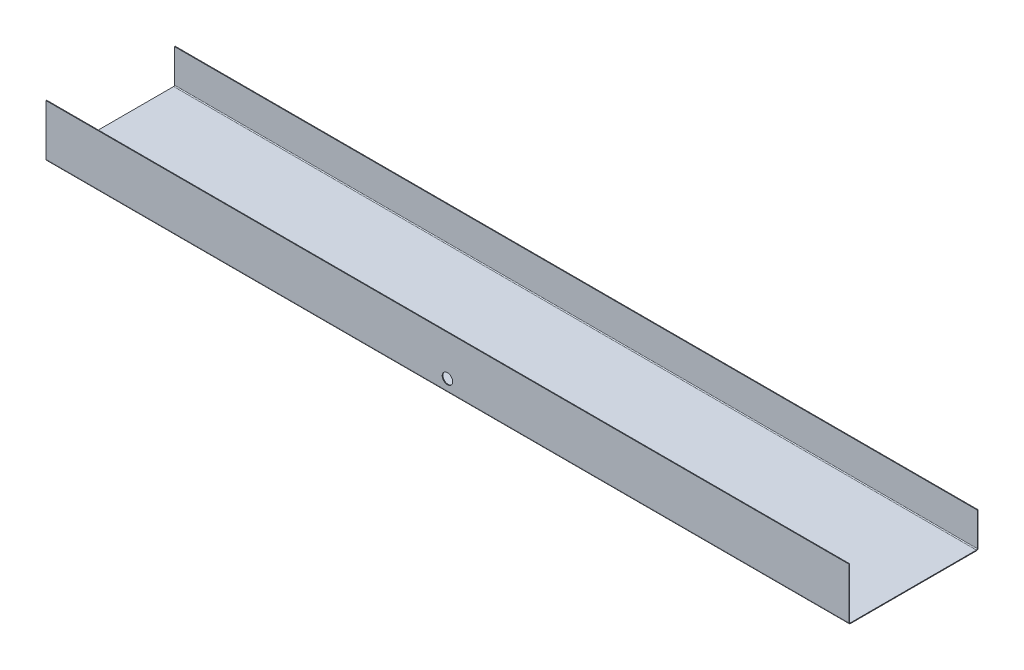
ISO-10303-21;
HEADER;
FILE_DESCRIPTION(('STEP AP214'),'2;1');
FILE_NAME('part.step','',(''),(''),'','','');
FILE_SCHEMA(('AUTOMOTIVE_DESIGN { 1 0 10303 214 1 1 1 1 }'));
ENDSEC;
DATA;
#1=APPLICATION_CONTEXT('core data for automotive mechanical design processes');
#2=APPLICATION_PROTOCOL_DEFINITION('international standard','automotive_design',2000,#1);
#3=PRODUCT_CONTEXT('',#1,'mechanical');
#4=PRODUCT('Part','Part','',(#3));
#5=PRODUCT_RELATED_PRODUCT_CATEGORY('part','',(#4));
#6=PRODUCT_DEFINITION_FORMATION('','',#4);
#7=PRODUCT_DEFINITION_CONTEXT('part definition',#1,'design');
#8=PRODUCT_DEFINITION('design','',#6,#7);
#9=PRODUCT_DEFINITION_SHAPE('','',#8);
#10=(LENGTH_UNIT() NAMED_UNIT(*) SI_UNIT(.MILLI.,.METRE.));
#11=(NAMED_UNIT(*) PLANE_ANGLE_UNIT() SI_UNIT($,.RADIAN.));
#12=(NAMED_UNIT(*) SI_UNIT($,.STERADIAN.) SOLID_ANGLE_UNIT());
#13=UNCERTAINTY_MEASURE_WITH_UNIT(LENGTH_MEASURE(1.E-05),#10,'distance_accuracy_value','');
#14=(GEOMETRIC_REPRESENTATION_CONTEXT(3) GLOBAL_UNCERTAINTY_ASSIGNED_CONTEXT((#13)) GLOBAL_UNIT_ASSIGNED_CONTEXT((#10,
#11,#12)) REPRESENTATION_CONTEXT('',''));
#15=CARTESIAN_POINT('',(0.,0.,0.));
#16=DIRECTION('',(0.,0.,1.));
#17=DIRECTION('',(1.,0.,0.));
#18=AXIS2_PLACEMENT_3D('',#15,#16,#17);
#19=CARTESIAN_POINT('',(1150.,-145.5,0.));
#20=DIRECTION('',(1.,0.,0.));
#21=DIRECTION('',(0.,0.,-1.));
#22=AXIS2_PLACEMENT_3D('',#19,#20,#21);
#23=PLANE('',#22);
#24=DIRECTION('',(0.,0.,-1.));
#25=VECTOR('',#24,1.);
#26=CARTESIAN_POINT('',(1150.,-145.5,0.));
#27=LINE('',#26,#25);
#28=CARTESIAN_POINT('',(1150.,-145.5,0.));
#29=VERTEX_POINT('',#28);
#30=CARTESIAN_POINT('',(1150.,-145.5,-2.00000000000002));
#31=VERTEX_POINT('',#30);
#32=EDGE_CURVE('E11',#29,#31,#27,.T.);
#33=ORIENTED_EDGE('',*,*,#32,.F.);
#34=CARTESIAN_POINT('',(1150.,-145.5,-4.50000000000002));
#35=DIRECTION('',(-1.,0.,0.));
#36=DIRECTION('',(0.,0.,1.));
#37=AXIS2_PLACEMENT_3D('',#34,#35,#36);
#38=CIRCLE('',#37,4.5);
#39=CARTESIAN_POINT('',(1150.,-150.,-4.50000000000002));
#40=VERTEX_POINT('',#39);
#41=EDGE_CURVE('E150',#29,#40,#38,.F.);
#42=ORIENTED_EDGE('',*,*,#41,.T.);
#43=DIRECTION('',(0.,-1.,0.));
#44=VECTOR('',#43,1.);
#45=CARTESIAN_POINT('',(1150.,-148.,-4.50000000000002));
#46=LINE('',#45,#44);
#47=CARTESIAN_POINT('',(1150.,-148.,-4.50000000000002));
#48=VERTEX_POINT('',#47);
#49=EDGE_CURVE('E48',#48,#40,#46,.T.);
#50=ORIENTED_EDGE('',*,*,#49,.F.);
#51=CARTESIAN_POINT('',(1150.,-145.5,-4.50000000000002));
#52=DIRECTION('',(1.,0.,0.));
#53=DIRECTION('',(0.,0.,-1.));
#54=AXIS2_PLACEMENT_3D('',#51,#52,#53);
#55=CIRCLE('',#54,2.5);
#56=EDGE_CURVE('E245',#31,#48,#55,.T.);
#57=ORIENTED_EDGE('',*,*,#56,.F.);
#58=EDGE_LOOP('',(#33,#42,#50,#57));
#59=FACE_BOUND('',#58,.T.);
#60=ADVANCED_FACE('F40',(#59),#23,.T.);
#61=CARTESIAN_POINT('',(1150.,-148.,-4.50000000000002));
#62=DIRECTION('',(1.,0.,0.));
#63=DIRECTION('',(0.,0.,-1.));
#64=AXIS2_PLACEMENT_3D('',#61,#62,#63);
#65=PLANE('',#64);
#66=DIRECTION('',(0.,-1.,0.));
#67=VECTOR('',#66,1.);
#68=CARTESIAN_POINT('',(1150.,0.,0.));
#69=LINE('',#68,#67);
#70=CARTESIAN_POINT('',(1150.,0.,0.));
#71=VERTEX_POINT('',#70);
#72=EDGE_CURVE('E155',#71,#29,#69,.T.);
#73=ORIENTED_EDGE('',*,*,#72,.T.);
#74=ORIENTED_EDGE('',*,*,#32,.T.);
#75=DIRECTION('',(0.,-1.,0.));
#76=VECTOR('',#75,1.);
#77=CARTESIAN_POINT('',(1150.,0.,-2.));
#78=LINE('',#77,#76);
#79=CARTESIAN_POINT('',(1150.,0.,-2.));
#80=VERTEX_POINT('',#79);
#81=EDGE_CURVE('E258',#80,#31,#78,.T.);
#82=ORIENTED_EDGE('',*,*,#81,.F.);
#83=DIRECTION('',(0.,0.,-1.));
#84=VECTOR('',#83,1.);
#85=CARTESIAN_POINT('',(1150.,0.,0.));
#86=LINE('',#85,#84);
#87=EDGE_CURVE('E260',#71,#80,#86,.T.);
#88=ORIENTED_EDGE('',*,*,#87,.F.);
#89=EDGE_LOOP('',(#73,#74,#82,#88));
#90=FACE_BOUND('',#89,.T.);
#91=ADVANCED_FACE('F271',(#90),#65,.T.);
#92=CARTESIAN_POINT('',(-1150.,-150.,-4.50000000000002));
#93=DIRECTION('',(-1.,0.,0.));
#94=DIRECTION('',(0.,0.,1.));
#95=AXIS2_PLACEMENT_3D('',#92,#93,#94);
#96=PLANE('',#95);
#97=DIRECTION('',(0.,1.,0.));
#98=VECTOR('',#97,1.);
#99=CARTESIAN_POINT('',(-1150.,-150.,-4.50000000000002));
#100=LINE('',#99,#98);
#101=CARTESIAN_POINT('',(-1150.,-150.,-4.50000000000002));
#102=VERTEX_POINT('',#101);
#103=CARTESIAN_POINT('',(-1150.,-148.,-4.50000000000002));
#104=VERTEX_POINT('',#103);
#105=EDGE_CURVE('E148',#102,#104,#100,.T.);
#106=ORIENTED_EDGE('',*,*,#105,.F.);
#107=CARTESIAN_POINT('',(-1150.,-145.5,-4.50000000000002));
#108=DIRECTION('',(-1.,0.,0.));
#109=DIRECTION('',(0.,0.,1.));
#110=AXIS2_PLACEMENT_3D('',#107,#108,#109);
#111=CIRCLE('',#110,4.5);
#112=CARTESIAN_POINT('',(-1150.,-145.5,0.));
#113=VERTEX_POINT('',#112);
#114=EDGE_CURVE('E162',#113,#102,#111,.F.);
#115=ORIENTED_EDGE('',*,*,#114,.F.);
#116=DIRECTION('',(0.,0.,1.));
#117=VECTOR('',#116,1.);
#118=CARTESIAN_POINT('',(-1150.,-145.5,-2.00000000000002));
#119=LINE('',#118,#117);
#120=CARTESIAN_POINT('',(-1150.,-145.5,-2.00000000000002));
#121=VERTEX_POINT('',#120);
#122=EDGE_CURVE('E236',#121,#113,#119,.T.);
#123=ORIENTED_EDGE('',*,*,#122,.F.);
#124=CARTESIAN_POINT('',(-1150.,-145.5,-4.50000000000002));
#125=DIRECTION('',(1.,0.,0.));
#126=DIRECTION('',(0.,0.,-1.));
#127=AXIS2_PLACEMENT_3D('',#124,#125,#126);
#128=CIRCLE('',#127,2.5);
#129=EDGE_CURVE('E190',#121,#104,#128,.T.);
#130=ORIENTED_EDGE('',*,*,#129,.T.);
#131=EDGE_LOOP('',(#106,#115,#123,#130));
#132=FACE_BOUND('',#131,.T.);
#133=ADVANCED_FACE('F250',(#132),#96,.T.);
#134=CARTESIAN_POINT('',(-1150.,-145.5,-2.00000000000002));
#135=DIRECTION('',(-1.,0.,0.));
#136=DIRECTION('',(0.,0.,1.));
#137=AXIS2_PLACEMENT_3D('',#134,#135,#136);
#138=PLANE('',#137);
#139=DIRECTION('',(0.,0.,-1.));
#140=VECTOR('',#139,1.);
#141=CARTESIAN_POINT('',(-1150.,-150.,0.));
#142=LINE('',#141,#140);
#143=CARTESIAN_POINT('',(-1150.,-150.,-365.5));
#144=VERTEX_POINT('',#143);
#145=EDGE_CURVE('E203',#102,#144,#142,.T.);
#146=ORIENTED_EDGE('',*,*,#145,.F.);
#147=ORIENTED_EDGE('',*,*,#105,.T.);
#148=DIRECTION('',(0.,0.,-1.));
#149=VECTOR('',#148,1.);
#150=CARTESIAN_POINT('',(-1150.,-148.,0.));
#151=LINE('',#150,#149);
#152=CARTESIAN_POINT('',(-1150.,-148.,-365.5));
#153=VERTEX_POINT('',#152);
#154=EDGE_CURVE('E188',#104,#153,#151,.T.);
#155=ORIENTED_EDGE('',*,*,#154,.T.);
#156=DIRECTION('',(0.,-1.,0.));
#157=VECTOR('',#156,1.);
#158=CARTESIAN_POINT('',(-1150.,-148.,-365.5));
#159=LINE('',#158,#157);
#160=EDGE_CURVE('E97',#153,#144,#159,.T.);
#161=ORIENTED_EDGE('',*,*,#160,.T.);
#162=EDGE_LOOP('',(#146,#147,#155,#161));
#163=FACE_BOUND('',#162,.T.);
#164=ADVANCED_FACE('F238',(#163),#138,.T.);
#165=CARTESIAN_POINT('',(1150.,-150.,-365.5));
#166=DIRECTION('',(1.,0.,0.));
#167=DIRECTION('',(0.,0.,-1.));
#168=AXIS2_PLACEMENT_3D('',#165,#166,#167);
#169=PLANE('',#168);
#170=DIRECTION('',(0.,1.,0.));
#171=VECTOR('',#170,1.);
#172=CARTESIAN_POINT('',(1150.,-150.,-365.5));
#173=LINE('',#172,#171);
#174=CARTESIAN_POINT('',(1150.,-150.,-365.5));
#175=VERTEX_POINT('',#174);
#176=CARTESIAN_POINT('',(1150.,-148.,-365.5));
#177=VERTEX_POINT('',#176);
#178=EDGE_CURVE('E234',#175,#177,#173,.T.);
#179=ORIENTED_EDGE('',*,*,#178,.F.);
#180=CARTESIAN_POINT('',(1150.,-145.5,-365.5));
#181=DIRECTION('',(-1.,0.,0.));
#182=DIRECTION('',(0.,0.,1.));
#183=AXIS2_PLACEMENT_3D('',#180,#181,#182);
#184=CIRCLE('',#183,4.5);
#185=CARTESIAN_POINT('',(1150.,-145.5,-370.));
#186=VERTEX_POINT('',#185);
#187=EDGE_CURVE('E170',#175,#186,#184,.F.);
#188=ORIENTED_EDGE('',*,*,#187,.T.);
#189=DIRECTION('',(0.,0.,-1.));
#190=VECTOR('',#189,1.);
#191=CARTESIAN_POINT('',(1150.,-145.5,-368.));
#192=LINE('',#191,#190);
#193=CARTESIAN_POINT('',(1150.,-145.5,-368.));
#194=VERTEX_POINT('',#193);
#195=EDGE_CURVE('E56',#194,#186,#192,.T.);
#196=ORIENTED_EDGE('',*,*,#195,.F.);
#197=CARTESIAN_POINT('',(1150.,-145.5,-365.5));
#198=DIRECTION('',(1.,0.,0.));
#199=DIRECTION('',(0.,0.,-1.));
#200=AXIS2_PLACEMENT_3D('',#197,#198,#199);
#201=CIRCLE('',#200,2.5);
#202=EDGE_CURVE('E262',#177,#194,#201,.T.);
#203=ORIENTED_EDGE('',*,*,#202,.F.);
#204=EDGE_LOOP('',(#179,#188,#196,#203));
#205=FACE_BOUND('',#204,.T.);
#206=ADVANCED_FACE('F299',(#205),#169,.T.);
#207=CARTESIAN_POINT('',(1150.,-145.5,-368.));
#208=DIRECTION('',(1.,0.,0.));
#209=DIRECTION('',(0.,0.,-1.));
#210=AXIS2_PLACEMENT_3D('',#207,#208,#209);
#211=PLANE('',#210);
#212=DIRECTION('',(0.,0.,-1.));
#213=VECTOR('',#212,1.);
#214=CARTESIAN_POINT('',(1150.,-150.,0.));
#215=LINE('',#214,#213);
#216=EDGE_CURVE('E140',#40,#175,#215,.T.);
#217=ORIENTED_EDGE('',*,*,#216,.T.);
#218=ORIENTED_EDGE('',*,*,#178,.T.);
#219=DIRECTION('',(0.,0.,-1.));
#220=VECTOR('',#219,1.);
#221=CARTESIAN_POINT('',(1150.,-148.,0.));
#222=LINE('',#221,#220);
#223=EDGE_CURVE('E143',#48,#177,#222,.T.);
#224=ORIENTED_EDGE('',*,*,#223,.F.);
#225=ORIENTED_EDGE('',*,*,#49,.T.);
#226=EDGE_LOOP('',(#217,#218,#224,#225));
#227=FACE_BOUND('',#226,.T.);
#228=ADVANCED_FACE('F138',(#227),#211,.T.);
#229=CARTESIAN_POINT('',(-1150.,-145.5,-370.));
#230=DIRECTION('',(-1.,0.,0.));
#231=DIRECTION('',(0.,0.,1.));
#232=AXIS2_PLACEMENT_3D('',#229,#230,#231);
#233=PLANE('',#232);
#234=DIRECTION('',(0.,0.,1.));
#235=VECTOR('',#234,1.);
#236=CARTESIAN_POINT('',(-1150.,-145.5,-370.));
#237=LINE('',#236,#235);
#238=CARTESIAN_POINT('',(-1150.,-145.5,-370.));
#239=VERTEX_POINT('',#238);
#240=CARTESIAN_POINT('',(-1150.,-145.5,-368.));
#241=VERTEX_POINT('',#240);
#242=EDGE_CURVE('E104',#239,#241,#237,.T.);
#243=ORIENTED_EDGE('',*,*,#242,.F.);
#244=CARTESIAN_POINT('',(-1150.,-145.5,-365.5));
#245=DIRECTION('',(-1.,0.,0.));
#246=DIRECTION('',(0.,0.,1.));
#247=AXIS2_PLACEMENT_3D('',#244,#245,#246);
#248=CIRCLE('',#247,4.5);
#249=EDGE_CURVE('E205',#144,#239,#248,.F.);
#250=ORIENTED_EDGE('',*,*,#249,.F.);
#251=ORIENTED_EDGE('',*,*,#160,.F.);
#252=CARTESIAN_POINT('',(-1150.,-145.5,-365.5));
#253=DIRECTION('',(1.,0.,0.));
#254=DIRECTION('',(0.,0.,-1.));
#255=AXIS2_PLACEMENT_3D('',#252,#253,#254);
#256=CIRCLE('',#255,2.5);
#257=EDGE_CURVE('E186',#153,#241,#256,.T.);
#258=ORIENTED_EDGE('',*,*,#257,.T.);
#259=EDGE_LOOP('',(#243,#250,#251,#258));
#260=FACE_BOUND('',#259,.T.);
#261=ADVANCED_FACE('F305',(#260),#233,.T.);
#262=CARTESIAN_POINT('',(-1150.,-148.,-365.5));
#263=DIRECTION('',(-1.,0.,0.));
#264=DIRECTION('',(0.,0.,1.));
#265=AXIS2_PLACEMENT_3D('',#262,#263,#264);
#266=PLANE('',#265);
#267=DIRECTION('',(0.,1.,0.));
#268=VECTOR('',#267,1.);
#269=CARTESIAN_POINT('',(-1150.,-150.,-370.));
#270=LINE('',#269,#268);
#271=CARTESIAN_POINT('',(-1150.,-50.,-370.));
#272=VERTEX_POINT('',#271);
#273=EDGE_CURVE('E176',#239,#272,#270,.T.);
#274=ORIENTED_EDGE('',*,*,#273,.F.);
#275=ORIENTED_EDGE('',*,*,#242,.T.);
#276=DIRECTION('',(0.,1.,0.));
#277=VECTOR('',#276,1.);
#278=CARTESIAN_POINT('',(-1150.,-150.,-368.));
#279=LINE('',#278,#277);
#280=CARTESIAN_POINT('',(-1150.,-50.,-368.));
#281=VERTEX_POINT('',#280);
#282=EDGE_CURVE('E183',#241,#281,#279,.T.);
#283=ORIENTED_EDGE('',*,*,#282,.T.);
#284=DIRECTION('',(0.,0.,-1.));
#285=VECTOR('',#284,1.);
#286=CARTESIAN_POINT('',(-1150.,-50.,-368.));
#287=LINE('',#286,#285);
#288=EDGE_CURVE('E179',#281,#272,#287,.T.);
#289=ORIENTED_EDGE('',*,*,#288,.T.);
#290=EDGE_LOOP('',(#274,#275,#283,#289));
#291=FACE_BOUND('',#290,.T.);
#292=ADVANCED_FACE('F308',(#291),#266,.T.);
#293=CARTESIAN_POINT('',(1150.,-150.,-370.));
#294=DIRECTION('',(0.,0.,1.));
#295=DIRECTION('',(1.,0.,0.));
#296=AXIS2_PLACEMENT_3D('',#293,#294,#295);
#297=PLANE('',#296);
#298=ORIENTED_EDGE('',*,*,#273,.T.);
#299=DIRECTION('',(-1.,0.,0.));
#300=VECTOR('',#299,1.);
#301=CARTESIAN_POINT('',(1150.,-50.,-370.));
#302=LINE('',#301,#300);
#303=CARTESIAN_POINT('',(1150.,-50.,-370.));
#304=VERTEX_POINT('',#303);
#305=EDGE_CURVE('E229',#304,#272,#302,.T.);
#306=ORIENTED_EDGE('',*,*,#305,.F.);
#307=DIRECTION('',(0.,1.,0.));
#308=VECTOR('',#307,1.);
#309=CARTESIAN_POINT('',(1150.,-150.,-370.));
#310=LINE('',#309,#308);
#311=EDGE_CURVE('E110',#186,#304,#310,.T.);
#312=ORIENTED_EDGE('',*,*,#311,.F.);
#313=DIRECTION('',(-1.,0.,0.));
#314=VECTOR('',#313,1.);
#315=CARTESIAN_POINT('',(1150.,-145.5,-370.));
#316=LINE('',#315,#314);
#317=EDGE_CURVE('E172',#186,#239,#316,.T.);
#318=ORIENTED_EDGE('',*,*,#317,.T.);
#319=EDGE_LOOP('',(#298,#306,#312,#318));
#320=FACE_BOUND('',#319,.T.);
#321=ADVANCED_FACE('F311',(#320),#297,.F.);
#322=CARTESIAN_POINT('',(1150.,-50.,-368.));
#323=DIRECTION('',(0.,1.,0.));
#324=DIRECTION('',(0.,0.,1.));
#325=AXIS2_PLACEMENT_3D('',#322,#323,#324);
#326=PLANE('',#325);
#327=ORIENTED_EDGE('',*,*,#288,.F.);
#328=DIRECTION('',(-1.,0.,0.));
#329=VECTOR('',#328,1.);
#330=CARTESIAN_POINT('',(1150.,-50.,-368.));
#331=LINE('',#330,#329);
#332=CARTESIAN_POINT('',(1150.,-50.,-368.));
#333=VERTEX_POINT('',#332);
#334=EDGE_CURVE('E227',#333,#281,#331,.T.);
#335=ORIENTED_EDGE('',*,*,#334,.F.);
#336=DIRECTION('',(0.,0.,-1.));
#337=VECTOR('',#336,1.);
#338=CARTESIAN_POINT('',(1150.,-50.,-368.));
#339=LINE('',#338,#337);
#340=EDGE_CURVE('E537',#333,#304,#339,.T.);
#341=ORIENTED_EDGE('',*,*,#340,.T.);
#342=ORIENTED_EDGE('',*,*,#305,.T.);
#343=EDGE_LOOP('',(#327,#335,#341,#342));
#344=FACE_BOUND('',#343,.T.);
#345=ADVANCED_FACE('F315',(#344),#326,.T.);
#346=CARTESIAN_POINT('',(1150.,-150.,-368.));
#347=DIRECTION('',(0.,0.,1.));
#348=DIRECTION('',(1.,0.,0.));
#349=AXIS2_PLACEMENT_3D('',#346,#347,#348);
#350=PLANE('',#349);
#351=ORIENTED_EDGE('',*,*,#282,.F.);
#352=DIRECTION('',(-1.,0.,0.));
#353=VECTOR('',#352,1.);
#354=CARTESIAN_POINT('',(1150.,-145.5,-368.));
#355=LINE('',#354,#353);
#356=EDGE_CURVE('E224',#194,#241,#355,.T.);
#357=ORIENTED_EDGE('',*,*,#356,.F.);
#358=DIRECTION('',(0.,1.,0.));
#359=VECTOR('',#358,1.);
#360=CARTESIAN_POINT('',(1150.,-150.,-368.));
#361=LINE('',#360,#359);
#362=EDGE_CURVE('E539',#194,#333,#361,.T.);
#363=ORIENTED_EDGE('',*,*,#362,.T.);
#364=ORIENTED_EDGE('',*,*,#334,.T.);
#365=EDGE_LOOP('',(#351,#357,#363,#364));
#366=FACE_BOUND('',#365,.T.);
#367=ADVANCED_FACE('F319',(#366),#350,.T.);
#368=CARTESIAN_POINT('',(1150.,-145.5,-365.5));
#369=DIRECTION('',(-1.,0.,0.));
#370=DIRECTION('',(0.,0.,1.));
#371=AXIS2_PLACEMENT_3D('',#368,#369,#370);
#372=CYLINDRICAL_SURFACE('',#371,2.5);
#373=ORIENTED_EDGE('',*,*,#257,.F.);
#374=DIRECTION('',(-1.,0.,0.));
#375=VECTOR('',#374,1.);
#376=CARTESIAN_POINT('',(1150.,-148.,-365.5));
#377=LINE('',#376,#375);
#378=EDGE_CURVE('E221',#177,#153,#377,.T.);
#379=ORIENTED_EDGE('',*,*,#378,.F.);
#380=ORIENTED_EDGE('',*,*,#202,.T.);
#381=ORIENTED_EDGE('',*,*,#356,.T.);
#382=EDGE_LOOP('',(#373,#379,#380,#381));
#383=FACE_BOUND('',#382,.T.);
#384=ADVANCED_FACE('F323',(#383),#372,.F.);
#385=CARTESIAN_POINT('',(1150.,-148.,0.));
#386=DIRECTION('',(0.,1.,0.));
#387=DIRECTION('',(0.,0.,1.));
#388=AXIS2_PLACEMENT_3D('',#385,#386,#387);
#389=PLANE('',#388);
#390=ORIENTED_EDGE('',*,*,#154,.F.);
#391=DIRECTION('',(-1.,0.,0.));
#392=VECTOR('',#391,1.);
#393=CARTESIAN_POINT('',(1150.,-148.,-4.50000000000002));
#394=LINE('',#393,#392);
#395=EDGE_CURVE('E218',#48,#104,#394,.T.);
#396=ORIENTED_EDGE('',*,*,#395,.F.);
#397=ORIENTED_EDGE('',*,*,#223,.T.);
#398=ORIENTED_EDGE('',*,*,#378,.T.);
#399=EDGE_LOOP('',(#390,#396,#397,#398));
#400=FACE_BOUND('',#399,.T.);
#401=ADVANCED_FACE('F247',(#400),#389,.T.);
#402=CARTESIAN_POINT('',(1150.,-145.5,-4.50000000000002));
#403=DIRECTION('',(-1.,0.,0.));
#404=DIRECTION('',(0.,0.,1.));
#405=AXIS2_PLACEMENT_3D('',#402,#403,#404);
#406=CYLINDRICAL_SURFACE('',#405,2.5);
#407=ORIENTED_EDGE('',*,*,#129,.F.);
#408=DIRECTION('',(-1.,0.,0.));
#409=VECTOR('',#408,1.);
#410=CARTESIAN_POINT('',(1150.,-145.5,-2.00000000000002));
#411=LINE('',#410,#409);
#412=EDGE_CURVE('E215',#31,#121,#411,.T.);
#413=ORIENTED_EDGE('',*,*,#412,.F.);
#414=ORIENTED_EDGE('',*,*,#56,.T.);
#415=ORIENTED_EDGE('',*,*,#395,.T.);
#416=EDGE_LOOP('',(#407,#413,#414,#415));
#417=FACE_BOUND('',#416,.T.);
#418=ADVANCED_FACE('F243',(#417),#406,.F.);
#419=CARTESIAN_POINT('',(1150.,0.,-2.));
#420=DIRECTION('',(0.,0.,-1.));
#421=DIRECTION('',(0.,1.,0.));
#422=AXIS2_PLACEMENT_3D('',#419,#420,#421);
#423=PLANE('',#422);
#424=CARTESIAN_POINT('',(0.,-115.,-2.00000000000001));
#425=DIRECTION('',(0.,0.,-1.));
#426=DIRECTION('',(0.,1.,0.));
#427=AXIS2_PLACEMENT_3D('',#424,#425,#426);
#428=CIRCLE('',#427,15.);
#429=CARTESIAN_POINT('',(0.,-99.9999999999999,-2.00000000000001));
#430=VERTEX_POINT('',#429);
#431=EDGE_CURVE('E180',#430,#430,#428,.T.);
#432=ORIENTED_EDGE('',*,*,#431,.F.);
#433=EDGE_LOOP('',(#432));
#434=FACE_BOUND('',#433,.T.);
#435=DIRECTION('',(0.,-1.,0.));
#436=VECTOR('',#435,1.);
#437=CARTESIAN_POINT('',(-1150.,0.,-2.));
#438=LINE('',#437,#436);
#439=CARTESIAN_POINT('',(-1150.,0.,-2.));
#440=VERTEX_POINT('',#439);
#441=EDGE_CURVE('E193',#440,#121,#438,.T.);
#442=ORIENTED_EDGE('',*,*,#441,.F.);
#443=DIRECTION('',(-1.,0.,0.));
#444=VECTOR('',#443,1.);
#445=CARTESIAN_POINT('',(1150.,0.,-2.));
#446=LINE('',#445,#444);
#447=EDGE_CURVE('E213',#80,#440,#446,.T.);
#448=ORIENTED_EDGE('',*,*,#447,.F.);
#449=ORIENTED_EDGE('',*,*,#81,.T.);
#450=ORIENTED_EDGE('',*,*,#412,.T.);
#451=EDGE_LOOP('',(#442,#448,#449,#450));
#452=FACE_BOUND('',#451,.T.);
#453=ADVANCED_FACE('F256',(#434,#452),#423,.T.);
#454=CARTESIAN_POINT('',(1150.,0.,0.));
#455=DIRECTION('',(0.,1.,0.));
#456=DIRECTION('',(0.,0.,1.));
#457=AXIS2_PLACEMENT_3D('',#454,#455,#456);
#458=PLANE('',#457);
#459=DIRECTION('',(0.,0.,-1.));
#460=VECTOR('',#459,1.);
#461=CARTESIAN_POINT('',(-1150.,0.,0.));
#462=LINE('',#461,#460);
#463=CARTESIAN_POINT('',(-1150.,0.,0.));
#464=VERTEX_POINT('',#463);
#465=EDGE_CURVE('E196',#464,#440,#462,.T.);
#466=ORIENTED_EDGE('',*,*,#465,.F.);
#467=DIRECTION('',(-1.,0.,0.));
#468=VECTOR('',#467,1.);
#469=CARTESIAN_POINT('',(1150.,0.,0.));
#470=LINE('',#469,#468);
#471=EDGE_CURVE('E211',#71,#464,#470,.T.);
#472=ORIENTED_EDGE('',*,*,#471,.F.);
#473=ORIENTED_EDGE('',*,*,#87,.T.);
#474=ORIENTED_EDGE('',*,*,#447,.T.);
#475=EDGE_LOOP('',(#466,#472,#473,#474));
#476=FACE_BOUND('',#475,.T.);
#477=ADVANCED_FACE('F277',(#476),#458,.T.);
#478=CARTESIAN_POINT('',(1150.,0.,0.));
#479=DIRECTION('',(0.,0.,-1.));
#480=DIRECTION('',(0.,1.,0.));
#481=AXIS2_PLACEMENT_3D('',#478,#479,#480);
#482=PLANE('',#481);
#483=CARTESIAN_POINT('',(0.,-115.,0.));
#484=DIRECTION('',(0.,0.,1.));
#485=DIRECTION('',(1.,0.,0.));
#486=AXIS2_PLACEMENT_3D('',#483,#484,#485);
#487=CIRCLE('',#486,15.);
#488=CARTESIAN_POINT('',(15.,-115.,0.));
#489=VERTEX_POINT('',#488);
#490=EDGE_CURVE('E549',#489,#489,#487,.T.);
#491=ORIENTED_EDGE('',*,*,#490,.F.);
#492=EDGE_LOOP('',(#491));
#493=FACE_BOUND('',#492,.T.);
#494=DIRECTION('',(0.,-1.,0.));
#495=VECTOR('',#494,1.);
#496=CARTESIAN_POINT('',(-1150.,0.,0.));
#497=LINE('',#496,#495);
#498=EDGE_CURVE('E199',#464,#113,#497,.T.);
#499=ORIENTED_EDGE('',*,*,#498,.T.);
#500=DIRECTION('',(-1.,0.,0.));
#501=VECTOR('',#500,1.);
#502=CARTESIAN_POINT('',(1150.,-145.5,0.));
#503=LINE('',#502,#501);
#504=EDGE_CURVE('E164',#29,#113,#503,.T.);
#505=ORIENTED_EDGE('',*,*,#504,.F.);
#506=ORIENTED_EDGE('',*,*,#72,.F.);
#507=ORIENTED_EDGE('',*,*,#471,.T.);
#508=EDGE_LOOP('',(#499,#505,#506,#507));
#509=FACE_BOUND('',#508,.T.);
#510=ADVANCED_FACE('F273',(#493,#509),#482,.F.);
#511=CARTESIAN_POINT('',(1150.,-145.5,-4.50000000000002));
#512=DIRECTION('',(-1.,0.,0.));
#513=DIRECTION('',(0.,0.,1.));
#514=AXIS2_PLACEMENT_3D('',#511,#512,#513);
#515=CYLINDRICAL_SURFACE('',#514,4.5);
#516=ORIENTED_EDGE('',*,*,#114,.T.);
#517=DIRECTION('',(-1.,0.,0.));
#518=VECTOR('',#517,1.);
#519=CARTESIAN_POINT('',(1150.,-150.,-4.50000000000002));
#520=LINE('',#519,#518);
#521=EDGE_CURVE('E159',#40,#102,#520,.T.);
#522=ORIENTED_EDGE('',*,*,#521,.F.);
#523=ORIENTED_EDGE('',*,*,#41,.F.);
#524=ORIENTED_EDGE('',*,*,#504,.T.);
#525=EDGE_LOOP('',(#516,#522,#523,#524));
#526=FACE_BOUND('',#525,.T.);
#527=ADVANCED_FACE('F160',(#526),#515,.T.);
#528=CARTESIAN_POINT('',(1150.,-150.,0.));
#529=DIRECTION('',(0.,1.,0.));
#530=DIRECTION('',(0.,0.,1.));
#531=AXIS2_PLACEMENT_3D('',#528,#529,#530);
#532=PLANE('',#531);
#533=ORIENTED_EDGE('',*,*,#145,.T.);
#534=DIRECTION('',(-1.,0.,0.));
#535=VECTOR('',#534,1.);
#536=CARTESIAN_POINT('',(1150.,-150.,-365.5));
#537=LINE('',#536,#535);
#538=EDGE_CURVE('E165',#175,#144,#537,.T.);
#539=ORIENTED_EDGE('',*,*,#538,.F.);
#540=ORIENTED_EDGE('',*,*,#216,.F.);
#541=ORIENTED_EDGE('',*,*,#521,.T.);
#542=EDGE_LOOP('',(#533,#539,#540,#541));
#543=FACE_BOUND('',#542,.T.);
#544=ADVANCED_FACE('F167',(#543),#532,.F.);
#545=CARTESIAN_POINT('',(1150.,-145.5,-365.5));
#546=DIRECTION('',(-1.,0.,0.));
#547=DIRECTION('',(0.,0.,1.));
#548=AXIS2_PLACEMENT_3D('',#545,#546,#547);
#549=CYLINDRICAL_SURFACE('',#548,4.5);
#550=ORIENTED_EDGE('',*,*,#249,.T.);
#551=ORIENTED_EDGE('',*,*,#317,.F.);
#552=ORIENTED_EDGE('',*,*,#187,.F.);
#553=ORIENTED_EDGE('',*,*,#538,.T.);
#554=EDGE_LOOP('',(#550,#551,#552,#553));
#555=FACE_BOUND('',#554,.T.);
#556=ADVANCED_FACE('F377',(#555),#549,.T.);
#557=CARTESIAN_POINT('',(1150.,-145.5,-365.5));
#558=DIRECTION('',(1.,0.,0.));
#559=DIRECTION('',(0.,0.,-1.));
#560=AXIS2_PLACEMENT_3D('',#557,#558,#559);
#561=PLANE('',#560);
#562=ORIENTED_EDGE('',*,*,#311,.T.);
#563=ORIENTED_EDGE('',*,*,#340,.F.);
#564=ORIENTED_EDGE('',*,*,#362,.F.);
#565=ORIENTED_EDGE('',*,*,#195,.T.);
#566=EDGE_LOOP('',(#562,#563,#564,#565));
#567=FACE_BOUND('',#566,.T.);
#568=ADVANCED_FACE('F373',(#567),#561,.T.);
#569=CARTESIAN_POINT('',(-1150.,-145.5,-365.5));
#570=DIRECTION('',(1.,0.,0.));
#571=DIRECTION('',(0.,0.,-1.));
#572=AXIS2_PLACEMENT_3D('',#569,#570,#571);
#573=PLANE('',#572);
#574=ORIENTED_EDGE('',*,*,#441,.T.);
#575=ORIENTED_EDGE('',*,*,#122,.T.);
#576=ORIENTED_EDGE('',*,*,#498,.F.);
#577=ORIENTED_EDGE('',*,*,#465,.T.);
#578=EDGE_LOOP('',(#574,#575,#576,#577));
#579=FACE_BOUND('',#578,.T.);
#580=ADVANCED_FACE('F275',(#579),#573,.F.);
#581=CARTESIAN_POINT('',(0.,-115.,-10.));
#582=DIRECTION('',(0.,0.,1.));
#583=DIRECTION('',(1.,0.,0.));
#584=AXIS2_PLACEMENT_3D('',#581,#582,#583);
#585=CYLINDRICAL_SURFACE('',#584,15.);
#586=ORIENTED_EDGE('',*,*,#431,.T.);
#587=EDGE_LOOP('',(#586));
#588=FACE_BOUND('',#587,.T.);
#589=ORIENTED_EDGE('',*,*,#490,.T.);
#590=EDGE_LOOP('',(#589));
#591=FACE_BOUND('',#590,.T.);
#592=ADVANCED_FACE('F361',(#588,#591),#585,.F.);
#593=CLOSED_SHELL('',(#60,#91,#133,#164,#206,#228,#261,#292,#321,#345,#367,#384,#401,#418,#453,
#477,#510,#527,#544,#556,#568,#580,#592));
#594=MANIFOLD_SOLID_BREP('B2',#593);
#595=ADVANCED_BREP_SHAPE_REPRESENTATION('',(#18,#594),#14);
#596=SHAPE_DEFINITION_REPRESENTATION(#9,#595);
ENDSEC;
END-ISO-10303-21;
